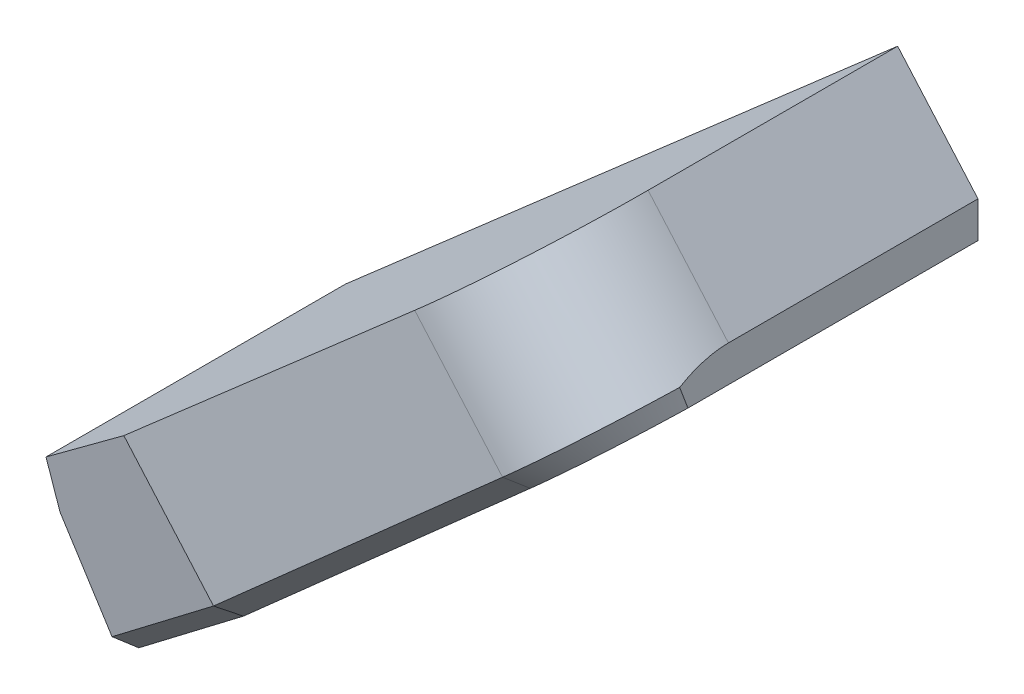
ISO-10303-21;
HEADER;
FILE_DESCRIPTION(('STEP AP214'),'2;1');
FILE_NAME('part.step','',(''),(''),'','','');
FILE_SCHEMA(('AUTOMOTIVE_DESIGN { 1 0 10303 214 1 1 1 1 }'));
ENDSEC;
DATA;
#1=APPLICATION_CONTEXT('core data for automotive mechanical design processes');
#2=APPLICATION_PROTOCOL_DEFINITION('international standard','automotive_design',2000,#1);
#3=PRODUCT_CONTEXT('',#1,'mechanical');
#4=PRODUCT('Part','Part','',(#3));
#5=PRODUCT_RELATED_PRODUCT_CATEGORY('part','',(#4));
#6=PRODUCT_DEFINITION_FORMATION('','',#4);
#7=PRODUCT_DEFINITION_CONTEXT('part definition',#1,'design');
#8=PRODUCT_DEFINITION('design','',#6,#7);
#9=PRODUCT_DEFINITION_SHAPE('','',#8);
#10=(LENGTH_UNIT() NAMED_UNIT(*) SI_UNIT(.MILLI.,.METRE.));
#11=(NAMED_UNIT(*) PLANE_ANGLE_UNIT() SI_UNIT($,.RADIAN.));
#12=(NAMED_UNIT(*) SI_UNIT($,.STERADIAN.) SOLID_ANGLE_UNIT());
#13=UNCERTAINTY_MEASURE_WITH_UNIT(LENGTH_MEASURE(1.E-05),#10,'distance_accuracy_value','');
#14=(GEOMETRIC_REPRESENTATION_CONTEXT(3) GLOBAL_UNCERTAINTY_ASSIGNED_CONTEXT((#13)) GLOBAL_UNIT_ASSIGNED_CONTEXT((#10,
#11,#12)) REPRESENTATION_CONTEXT('',''));
#15=CARTESIAN_POINT('',(0.,0.,0.));
#16=DIRECTION('',(0.,0.,1.));
#17=DIRECTION('',(1.,0.,0.));
#18=AXIS2_PLACEMENT_3D('',#15,#16,#17);
#19=CARTESIAN_POINT('',(713.784331276476,57.2270617719449,-19.05));
#20=DIRECTION('',(-1.,0.,0.));
#21=DIRECTION('',(0.,0.,1.));
#22=AXIS2_PLACEMENT_3D('',#19,#20,#21);
#23=PLANE('',#22);
#24=CARTESIAN_POINT('',(713.784331276476,33.7029371806042,4.7625));
#25=DIRECTION('',(-1.,0.,0.));
#26=DIRECTION('',(0.,1.,0.));
#27=AXIS2_PLACEMENT_3D('',#24,#25,#26);
#28=ELLIPSE('',#27,19.3103423347557,12.7);
#29=CARTESIAN_POINT('',(713.784331276476,53.0132795153599,4.7625));
#30=VERTEX_POINT('',#29);
#31=CARTESIAN_POINT('',(713.784331276476,51.6672722408811,9.42098174668878));
#32=VERTEX_POINT('',#31);
#33=EDGE_CURVE('E214',#30,#32,#28,.F.);
#34=ORIENTED_EDGE('',*,*,#33,.T.);
#35=CARTESIAN_POINT('',(713.784331276476,49.5606966341576,8.62972275566893));
#36=CARTESIAN_POINT('',(713.784331304837,49.6421115200021,8.66059883983428));
#37=CARTESIAN_POINT('',(713.784331597905,49.7235403944614,8.69143802243214));
#38=CARTESIAN_POINT('',(713.784332411528,49.8882108564469,8.75372407516755));
#39=CARTESIAN_POINT('',(713.784332936933,49.9714530162575,8.78516943237111));
#40=CARTESIAN_POINT('',(713.784333894609,50.1397497590857,8.848669443204));
#41=CARTESIAN_POINT('',(713.784334324638,50.2248048764804,8.88072268041721));
#42=CARTESIAN_POINT('',(713.784334925587,50.3967274476425,8.9454394332939));
#43=CARTESIAN_POINT('',(713.78433509087,50.4835954053474,8.97810161016965));
#44=CARTESIAN_POINT('',(713.784335099207,50.6591436368708,9.04403694860167));
#45=CARTESIAN_POINT('',(713.784334935555,50.7478243881636,9.0773088388525));
#46=CARTESIAN_POINT('',(713.784334344555,50.926998298572,9.14446392455359));
#47=CARTESIAN_POINT('',(713.784333911951,51.0174919132091,9.17834590460076));
#48=CARTESIAN_POINT('',(713.784332953845,51.2002917251027,9.24672118444291));
#49=CARTESIAN_POINT('',(713.784332426676,51.2925983594547,9.28121331562041));
#50=CARTESIAN_POINT('',(713.784331593389,51.4790245515618,9.35080839516426));
#51=CARTESIAN_POINT('',(713.78433129176,51.5731445327971,9.38591020916599));
#52=CARTESIAN_POINT('',(713.784331276476,51.6672751441984,9.42098348729397));
#53=B_SPLINE_CURVE_WITH_KNOTS('',3,(#35,#36,#37,#38,#39,#40,#41,#42,#43,#44,#45,#46,#47,#48,#49,
#50,#51,#52),.UNSPECIFIED.,.F.,.F.,(4,2,2,2,2,2,2,2,4),(0.,0.26121913580384,0.528169678245263,
0.80085270434248,1.07926916411968,1.36341989185319,1.6533056163849,1.94892697062322,
2.2502845003358),.UNSPECIFIED.);
#54=CARTESIAN_POINT('',(713.784331276476,49.5606966341576,8.62972275566891));
#55=VERTEX_POINT('',#54);
#56=EDGE_CURVE('E275',#32,#55,#53,.F.);
#57=ORIENTED_EDGE('',*,*,#56,.T.);
#58=DIRECTION('',(0.,0.,1.));
#59=VECTOR('',#58,1.);
#60=CARTESIAN_POINT('',(713.784331276476,49.5606966341576,-19.05));
#61=LINE('',#60,#59);
#62=CARTESIAN_POINT('',(713.784331276476,49.5606966341576,-19.05));
#63=VERTEX_POINT('',#62);
#64=EDGE_CURVE('E124',#63,#55,#61,.T.);
#65=ORIENTED_EDGE('',*,*,#64,.F.);
#66=DIRECTION('',(0.,-1.,0.));
#67=VECTOR('',#66,1.);
#68=CARTESIAN_POINT('',(713.784331276476,57.2270617719449,-19.05));
#69=LINE('',#68,#67);
#70=CARTESIAN_POINT('',(713.784331276476,53.01327951536,-19.05));
#71=VERTEX_POINT('',#70);
#72=EDGE_CURVE('E225',#71,#63,#69,.T.);
#73=ORIENTED_EDGE('',*,*,#72,.F.);
#74=DIRECTION('',(0.,0.,1.));
#75=VECTOR('',#74,1.);
#76=CARTESIAN_POINT('',(713.784331276476,53.0132795153599,-19.05));
#77=LINE('',#76,#75);
#78=EDGE_CURVE('E120',#71,#30,#77,.T.);
#79=ORIENTED_EDGE('',*,*,#78,.T.);
#80=EDGE_LOOP('',(#34,#57,#65,#73,#79));
#81=FACE_BOUND('',#80,.T.);
#82=ADVANCED_FACE('F33',(#81),#23,.F.);
#83=CARTESIAN_POINT('',(713.784331276476,49.5606966341576,-19.05));
#84=DIRECTION('',(-0.66308485715519,0.748544235307094,0.));
#85=DIRECTION('',(-0.748544235307094,-0.66308485715519,0.));
#86=AXIS2_PLACEMENT_3D('',#83,#84,#85);
#87=PLANE('',#86);
#88=ORIENTED_EDGE('',*,*,#64,.T.);
#89=CARTESIAN_POINT('',(705.480705262986,42.2050743351408,15.8544887273142));
#90=CARTESIAN_POINT('',(705.922192892045,42.5961584523409,15.8903938299688));
#91=CARTESIAN_POINT('',(706.365821397617,42.9891390276655,15.8791170099545));
#92=CARTESIAN_POINT('',(707.246121965533,43.7689379343943,15.762612512736));
#93=CARTESIAN_POINT('',(707.682779104303,44.15574304601,15.6573656048336));
#94=CARTESIAN_POINT('',(708.538051212872,44.9133709284914,15.3555472546245));
#95=CARTESIAN_POINT('',(708.956650739079,45.2841800189198,15.158981262232));
#96=CARTESIAN_POINT('',(709.765178063903,46.0003998498925,14.6795125676823));
#97=CARTESIAN_POINT('',(710.155091262996,46.345797657702,14.39661852326));
#98=CARTESIAN_POINT('',(710.89634438251,47.0024238070802,13.7516737358211));
#99=CARTESIAN_POINT('',(711.247670918172,47.3136402919932,13.3896346385306));
#100=CARTESIAN_POINT('',(711.902828578833,47.8940002805451,12.595589634467));
#101=CARTESIAN_POINT('',(712.206647873693,48.1631333046615,12.163598065713));
#102=CARTESIAN_POINT('',(712.759074882855,48.6524911370796,11.2406145441161));
#103=CARTESIAN_POINT('',(713.007672622019,48.8727071090788,10.7496392575266));
#104=CARTESIAN_POINT('',(713.443342234256,49.2586374375368,9.72115281201333));
#105=CARTESIAN_POINT('',(713.630421240179,49.4243581125056,9.1836676622926));
#106=CARTESIAN_POINT('',(713.784331276476,49.5606966341576,8.62972275566893));
#107=B_SPLINE_CURVE_WITH_KNOTS('',3,(#89,#90,#91,#92,#93,#94,#95,#96,#97,#98,#99,#100,#101,#102,
#103,#104,#105,#106),.UNSPECIFIED.,.F.,.F.,(4,2,2,2,2,2,2,2,4),(4.65162135877503,
4.81113636550038,4.97065137222574,5.13016637895109,5.28968138567645,5.4491963924018,
5.60871139912716,5.76822640585251,5.92774141257787),.UNSPECIFIED.);
#108=CARTESIAN_POINT('',(705.98588441586,42.6525784780102,15.875));
#109=VERTEX_POINT('',#108);
#110=EDGE_CURVE('E159',#55,#109,#107,.F.);
#111=ORIENTED_EDGE('',*,*,#110,.T.);
#112=DIRECTION('',(-0.748544235307094,-0.66308485715519,0.));
#113=VECTOR('',#112,1.);
#114=CARTESIAN_POINT('',(713.784331276476,49.5606966341576,15.875));
#115=LINE('',#114,#113);
#116=CARTESIAN_POINT('',(678.612948288187,18.4047403596793,15.875));
#117=VERTEX_POINT('',#116);
#118=EDGE_CURVE('E154',#109,#117,#115,.T.);
#119=ORIENTED_EDGE('',*,*,#118,.T.);
#120=DIRECTION('',(-0.697590960877624,-0.617948787564335,-0.362637763132305));
#121=VECTOR('',#120,1.);
#122=CARTESIAN_POINT('',(700.324002270979,37.6370989162351,27.1613389767259));
#123=LINE('',#122,#121);
#124=CARTESIAN_POINT('',(657.836177185816,0.,5.07434141893577));
#125=VERTEX_POINT('',#124);
#126=EDGE_CURVE('E123',#117,#125,#123,.T.);
#127=ORIENTED_EDGE('',*,*,#126,.T.);
#128=DIRECTION('',(0.,0.,1.));
#129=VECTOR('',#128,1.);
#130=CARTESIAN_POINT('',(657.836177185816,0.,-19.05));
#131=LINE('',#130,#129);
#132=CARTESIAN_POINT('',(657.836177185816,0.,-19.05));
#133=VERTEX_POINT('',#132);
#134=EDGE_CURVE('E147',#133,#125,#131,.T.);
#135=ORIENTED_EDGE('',*,*,#134,.F.);
#136=DIRECTION('',(-0.748544235307094,-0.66308485715519,0.));
#137=VECTOR('',#136,1.);
#138=CARTESIAN_POINT('',(713.784331276476,49.5606966341576,-19.05));
#139=LINE('',#138,#137);
#140=EDGE_CURVE('E227',#63,#133,#139,.T.);
#141=ORIENTED_EDGE('',*,*,#140,.F.);
#142=EDGE_LOOP('',(#88,#111,#119,#127,#135,#141));
#143=FACE_BOUND('',#142,.T.);
#144=ADVANCED_FACE('F165',(#143),#87,.F.);
#145=CARTESIAN_POINT('',(657.836177185816,0.,-19.05));
#146=DIRECTION('',(0.923162342718971,0.384410313318493,0.));
#147=DIRECTION('',(-0.384410313318493,0.923162342718971,0.));
#148=AXIS2_PLACEMENT_3D('',#145,#146,#147);
#149=PLANE('',#148);
#150=ORIENTED_EDGE('',*,*,#134,.T.);
#151=DIRECTION('',(0.254003340701628,-0.609989667124988,-0.750596368838246));
#152=VECTOR('',#151,1.);
#153=CARTESIAN_POINT('',(650.534949686741,17.5339163629187,26.6499428804333));
#154=LINE('',#153,#152);
#155=CARTESIAN_POINT('',(657.191041884151,1.54929406371575,6.98075813574454));
#156=VERTEX_POINT('',#155);
#157=EDGE_CURVE('E44',#125,#156,#154,.F.);
#158=ORIENTED_EDGE('',*,*,#157,.T.);
#159=DIRECTION('',(-0.381508284268291,0.916193112592195,0.122644239462319));
#160=VECTOR('',#159,1.);
#161=CARTESIAN_POINT('',(659.044447107056,-2.90166328135086,6.38494021159486));
#162=LINE('',#161,#160);
#163=CARTESIAN_POINT('',(653.432095085385,10.5764143377497,8.1891543628362));
#164=VERTEX_POINT('',#163);
#165=EDGE_CURVE('E223',#156,#164,#162,.T.);
#166=ORIENTED_EDGE('',*,*,#165,.T.);
#167=DIRECTION('',(0.,0.,1.));
#168=VECTOR('',#167,1.);
#169=CARTESIAN_POINT('',(653.432095085385,10.5764143377497,-19.05));
#170=LINE('',#169,#168);
#171=CARTESIAN_POINT('',(653.432095085385,10.5764143377497,-19.05));
#172=VERTEX_POINT('',#171);
#173=EDGE_CURVE('E141',#172,#164,#170,.T.);
#174=ORIENTED_EDGE('',*,*,#173,.F.);
#175=DIRECTION('',(-0.384410313318493,0.923162342718971,0.));
#176=VECTOR('',#175,1.);
#177=CARTESIAN_POINT('',(657.836177185816,0.,-19.05));
#178=LINE('',#177,#176);
#179=EDGE_CURVE('E229',#133,#172,#178,.T.);
#180=ORIENTED_EDGE('',*,*,#179,.F.);
#181=EDGE_LOOP('',(#150,#158,#166,#174,#180));
#182=FACE_BOUND('',#181,.T.);
#183=ADVANCED_FACE('F175',(#182),#149,.F.);
#184=CARTESIAN_POINT('',(653.432095085385,10.5764143377497,-19.05));
#185=DIRECTION('',(1.,0.,0.));
#186=DIRECTION('',(0.,0.,-1.));
#187=AXIS2_PLACEMENT_3D('',#184,#185,#186);
#188=PLANE('',#187);
#189=ORIENTED_EDGE('',*,*,#173,.T.);
#190=DIRECTION('',(0.,0.96877660271704,0.24793526176813));
#191=VECTOR('',#190,1.);
#192=CARTESIAN_POINT('',(653.432095085385,4.03373614736392,6.51471195243075));
#193=LINE('',#192,#191);
#194=CARTESIAN_POINT('',(653.432095085385,15.7960671975197,9.52499999999993));
#195=VERTEX_POINT('',#194);
#196=EDGE_CURVE('E218',#164,#195,#193,.T.);
#197=ORIENTED_EDGE('',*,*,#196,.T.);
#198=DIRECTION('',(0.,0.,1.));
#199=VECTOR('',#198,1.);
#200=CARTESIAN_POINT('',(653.432095085385,15.7960671975198,-19.05));
#201=LINE('',#200,#199);
#202=CARTESIAN_POINT('',(653.432095085385,15.7960671975198,-19.05));
#203=VERTEX_POINT('',#202);
#204=EDGE_CURVE('E139',#203,#195,#201,.T.);
#205=ORIENTED_EDGE('',*,*,#204,.F.);
#206=DIRECTION('',(0.,1.,0.));
#207=VECTOR('',#206,1.);
#208=CARTESIAN_POINT('',(653.432095085385,10.5764143377497,-19.05));
#209=LINE('',#208,#207);
#210=EDGE_CURVE('E130',#172,#203,#209,.T.);
#211=ORIENTED_EDGE('',*,*,#210,.F.);
#212=EDGE_LOOP('',(#189,#197,#205,#211));
#213=FACE_BOUND('',#212,.T.);
#214=ADVANCED_FACE('F236',(#213),#188,.F.);
#215=CARTESIAN_POINT('',(653.432095085385,15.7960671975198,-19.05));
#216=DIRECTION('',(0.657678656330287,-0.753298602818025,0.));
#217=DIRECTION('',(0.753298602818025,0.657678656330287,0.));
#218=AXIS2_PLACEMENT_3D('',#215,#216,#217);
#219=PLANE('',#218);
#220=ORIENTED_EDGE('',*,*,#204,.T.);
#221=DIRECTION('',(-0.702019306823435,-0.612908496978974,-0.362645925357115));
#222=VECTOR('',#221,1.);
#223=CARTESIAN_POINT('',(646.777147884434,9.98586561650411,6.08721778741128));
#224=LINE('',#223,#222);
#225=CARTESIAN_POINT('',(668.797711677998,29.2112494858078,17.4625));
#226=VERTEX_POINT('',#225);
#227=EDGE_CURVE('E205',#226,#195,#224,.T.);
#228=ORIENTED_EDGE('',*,*,#227,.F.);
#229=DIRECTION('',(-0.753298602818027,-0.657678656330285,0.));
#230=VECTOR('',#229,1.);
#231=CARTESIAN_POINT('',(668.797711677998,29.2112494858078,17.4625));
#232=LINE('',#231,#230);
#233=CARTESIAN_POINT('',(696.5510738829,53.441739088849,17.4625));
#234=VERTEX_POINT('',#233);
#235=EDGE_CURVE('E239',#234,#226,#232,.T.);
#236=ORIENTED_EDGE('',*,*,#235,.F.);
#237=CARTESIAN_POINT('',(696.5510738829,53.441739088849,4.7625));
#238=DIRECTION('',(0.657678656330287,-0.753298602818025,0.));
#239=DIRECTION('',(-0.753298602818025,-0.657678656330287,0.));
#240=AXIS2_PLACEMENT_3D('',#237,#238,#239);
#241=CIRCLE('',#240,12.7);
#242=CARTESIAN_POINT('',(706.117966138689,61.7942580242437,4.7625));
#243=VERTEX_POINT('',#242);
#244=EDGE_CURVE('E138',#243,#234,#241,.T.);
#245=ORIENTED_EDGE('',*,*,#244,.F.);
#246=DIRECTION('',(0.,0.,1.));
#247=VECTOR('',#246,1.);
#248=CARTESIAN_POINT('',(706.117966138689,61.7942580242437,-19.05));
#249=LINE('',#248,#247);
#250=CARTESIAN_POINT('',(706.117966138689,61.7942580242437,-19.05));
#251=VERTEX_POINT('',#250);
#252=EDGE_CURVE('E117',#251,#243,#249,.T.);
#253=ORIENTED_EDGE('',*,*,#252,.F.);
#254=DIRECTION('',(0.753298602818025,0.657678656330287,0.));
#255=VECTOR('',#254,1.);
#256=CARTESIAN_POINT('',(653.432095085385,15.7960671975198,-19.05));
#257=LINE('',#256,#255);
#258=EDGE_CURVE('E127',#203,#251,#257,.T.);
#259=ORIENTED_EDGE('',*,*,#258,.F.);
#260=EDGE_LOOP('',(#220,#228,#236,#245,#253,#259));
#261=FACE_BOUND('',#260,.T.);
#262=ADVANCED_FACE('F135',(#261),#219,.F.);
#263=CARTESIAN_POINT('',(0.,0.,-19.05));
#264=DIRECTION('',(0.,0.,1.));
#265=DIRECTION('',(1.,0.,0.));
#266=AXIS2_PLACEMENT_3D('',#263,#264,#265);
#267=PLANE('',#266);
#268=ORIENTED_EDGE('',*,*,#258,.T.);
#269=DIRECTION('',(0.657678656330287,-0.753298602818025,0.));
#270=VECTOR('',#269,1.);
#271=CARTESIAN_POINT('',(431.307474317415,376.55946674152,-19.05));
#272=LINE('',#271,#270);
#273=EDGE_CURVE('E112',#251,#71,#272,.T.);
#274=ORIENTED_EDGE('',*,*,#273,.T.);
#275=ORIENTED_EDGE('',*,*,#72,.T.);
#276=ORIENTED_EDGE('',*,*,#140,.T.);
#277=ORIENTED_EDGE('',*,*,#179,.T.);
#278=ORIENTED_EDGE('',*,*,#210,.T.);
#279=EDGE_LOOP('',(#268,#274,#275,#276,#277,#278));
#280=FACE_BOUND('',#279,.T.);
#281=ADVANCED_FACE('F128',(#280),#267,.F.);
#282=CARTESIAN_POINT('',(659.305926287526,-4.36447276717927,6.08721778741128));
#283=DIRECTION('',(0.273180668889165,0.238504484912521,-0.93192699972792));
#284=DIRECTION('',(-0.95962030219126,0.,-0.281298552471134));
#285=AXIS2_PLACEMENT_3D('',#282,#283,#284);
#286=PLANE('',#285);
#287=ORIENTED_EDGE('',*,*,#165,.F.);
#288=DIRECTION('',(0.697590960877624,0.617948787564335,0.362637763132305));
#289=VECTOR('',#288,1.);
#290=CARTESIAN_POINT('',(655.444893388317,0.00249886936541741,6.07303510012875));
#291=LINE('',#290,#289);
#292=CARTESIAN_POINT('',(677.354326357339,19.410587991386,17.4625));
#293=VERTEX_POINT('',#292);
#294=EDGE_CURVE('E11',#156,#293,#291,.T.);
#295=ORIENTED_EDGE('',*,*,#294,.T.);
#296=DIRECTION('',(-0.657678656330287,0.753298602818025,0.));
#297=VECTOR('',#296,1.);
#298=CARTESIAN_POINT('',(681.32649008109,14.8609111021245,17.4625));
#299=LINE('',#298,#297);
#300=EDGE_CURVE('E191',#293,#226,#299,.T.);
#301=ORIENTED_EDGE('',*,*,#300,.T.);
#302=ORIENTED_EDGE('',*,*,#227,.T.);
#303=ORIENTED_EDGE('',*,*,#196,.F.);
#304=EDGE_LOOP('',(#287,#295,#301,#302,#303));
#305=FACE_BOUND('',#304,.T.);
#306=ADVANCED_FACE('F331',(#305),#286,.F.);
#307=CARTESIAN_POINT('',(681.32649008109,14.8609111021245,17.4625));
#308=DIRECTION('',(0.,0.,-1.));
#309=DIRECTION('',(-1.,0.,0.));
#310=AXIS2_PLACEMENT_3D('',#307,#308,#309);
#311=PLANE('',#310);
#312=ORIENTED_EDGE('',*,*,#300,.F.);
#313=DIRECTION('',(0.748544235307094,0.66308485715519,0.));
#314=VECTOR('',#313,1.);
#315=CARTESIAN_POINT('',(677.321774873882,19.3817600553997,17.4625));
#316=LINE('',#315,#314);
#317=CARTESIAN_POINT('',(704.933237202746,43.8408924494508,17.4625));
#318=VERTEX_POINT('',#317);
#319=EDGE_CURVE('E200',#293,#318,#316,.T.);
#320=ORIENTED_EDGE('',*,*,#319,.T.);
#321=DIRECTION('',(-0.657678656330287,0.753298602818025,0.));
#322=VECTOR('',#321,1.);
#323=CARTESIAN_POINT('',(709.079852285992,39.0914007051657,17.4625));
#324=LINE('',#323,#322);
#325=EDGE_CURVE('E199',#318,#234,#324,.T.);
#326=ORIENTED_EDGE('',*,*,#325,.T.);
#327=ORIENTED_EDGE('',*,*,#235,.T.);
#328=EDGE_LOOP('',(#312,#320,#326,#327));
#329=FACE_BOUND('',#328,.T.);
#330=ADVANCED_FACE('F324',(#329),#311,.F.);
#331=CARTESIAN_POINT('',(709.079852285992,39.0914007051657,4.7625));
#332=DIRECTION('',(-0.657678656330287,0.753298602818025,0.));
#333=DIRECTION('',(-0.753298602818025,-0.657678656330287,0.));
#334=AXIS2_PLACEMENT_3D('',#331,#332,#333);
#335=CYLINDRICAL_SURFACE('',#334,12.7);
#336=ORIENTED_EDGE('',*,*,#325,.F.);
#337=CARTESIAN_POINT('',(713.852794808201,51.7278131754267,9.18218314933589));
#338=CARTESIAN_POINT('',(713.676758546246,51.572157020229,9.8152630426201));
#339=CARTESIAN_POINT('',(713.462784917983,51.3829555913895,10.429531785158));
#340=CARTESIAN_POINT('',(712.964483105895,50.9423432804,11.6049448657446));
#341=CARTESIAN_POINT('',(712.680146763799,50.6909251844783,12.1660594789898));
#342=CARTESIAN_POINT('',(712.048302421253,50.1322308566598,13.2208977893862));
#343=CARTESIAN_POINT('',(711.700805829975,49.8249647130704,13.7146024393909));
#344=CARTESIAN_POINT('',(710.951462198149,49.1623742481452,14.6220824440348));
#345=CARTESIAN_POINT('',(710.54962868845,48.8070618911624,15.035841412367));
#346=CARTESIAN_POINT('',(709.701812448129,48.0573992090673,15.77292116944));
#347=CARTESIAN_POINT('',(709.255845026469,47.6630624205653,16.0962286487797));
#348=CARTESIAN_POINT('',(708.331083189138,46.8453623031314,16.6441928711223));
#349=CARTESIAN_POINT('',(707.85230547183,46.4220137393573,16.8688397195708));
#350=CARTESIAN_POINT('',(706.87407878455,45.55703851571,17.2137749769527));
#351=CARTESIAN_POINT('',(706.374647478353,45.1154274746381,17.3340571574126));
#352=CARTESIAN_POINT('',(705.367794221084,44.2251398422209,17.4672051542337));
#353=CARTESIAN_POINT('',(704.860389339011,43.7764783437593,17.4800929485357));
#354=CARTESIAN_POINT('',(704.355433107512,43.329982010187,17.4390585455019));
#355=B_SPLINE_CURVE_WITH_KNOTS('',3,(#337,#338,#339,#340,#341,#342,#343,#344,#345,#346,#347,
#348,#349,#350,#351,#352,#353,#354),.UNSPECIFIED.,.F.,.F.,(4,2,2,2,2,2,2,2,4),(4.65162135877503,
4.81113636550038,4.97065137222574,5.13016637895109,5.28968138567645,5.4491963924018,
5.60871139912716,5.76822640585251,5.92774141257787),.UNSPECIFIED.);
#356=EDGE_CURVE('E264',#318,#32,#355,.F.);
#357=ORIENTED_EDGE('',*,*,#356,.T.);
#358=ORIENTED_EDGE('',*,*,#33,.F.);
#359=DIRECTION('',(-0.657678656330287,0.753298602818025,0.));
#360=VECTOR('',#359,1.);
#361=CARTESIAN_POINT('',(718.646744541781,47.4439196405603,4.7625));
#362=LINE('',#361,#360);
#363=EDGE_CURVE('E209',#30,#243,#362,.T.);
#364=ORIENTED_EDGE('',*,*,#363,.T.);
#365=ORIENTED_EDGE('',*,*,#244,.T.);
#366=EDGE_LOOP('',(#336,#357,#358,#364,#365));
#367=FACE_BOUND('',#366,.T.);
#368=ADVANCED_FACE('F318',(#367),#335,.T.);
#369=CARTESIAN_POINT('',(718.646744541781,47.4439196405603,4.7625));
#370=DIRECTION('',(-0.753298602818025,-0.657678656330287,0.));
#371=DIRECTION('',(0.657678656330287,-0.753298602818025,0.));
#372=AXIS2_PLACEMENT_3D('',#369,#370,#371);
#373=PLANE('',#372);
#374=ORIENTED_EDGE('',*,*,#273,.F.);
#375=ORIENTED_EDGE('',*,*,#252,.T.);
#376=ORIENTED_EDGE('',*,*,#363,.F.);
#377=ORIENTED_EDGE('',*,*,#78,.F.);
#378=EDGE_LOOP('',(#374,#375,#376,#377));
#379=FACE_BOUND('',#378,.T.);
#380=ADVANCED_FACE('F114',(#379),#373,.F.);
#381=CARTESIAN_POINT('',(700.324002270979,37.6370989162351,27.1613389767259));
#382=DIRECTION('',(-0.275201167597199,0.698390956709627,-0.660692355744601));
#383=DIRECTION('',(-0.697590960877624,-0.617948787564335,-0.362637763132305));
#384=AXIS2_PLACEMENT_3D('',#381,#382,#383);
#385=PLANE('',#384);
#386=ORIENTED_EDGE('',*,*,#157,.F.);
#387=ORIENTED_EDGE('',*,*,#126,.F.);
#388=CARTESIAN_POINT('',(678.612948288187,18.4047403596793,15.875));
#389=CARTESIAN_POINT('',(677.354325104551,19.4105886933377,17.4625012638338));
#390=B_SPLINE_CURVE_WITH_KNOTS('',1,(#388,#389),.UNSPECIFIED.,.F.,.F.,(2,2),(0.,1.),.UNSPECIFIED.);
#391=EDGE_CURVE('E241',#293,#117,#390,.F.);
#392=ORIENTED_EDGE('',*,*,#391,.F.);
#393=ORIENTED_EDGE('',*,*,#294,.F.);
#394=EDGE_LOOP('',(#386,#387,#392,#393));
#395=FACE_BOUND('',#394,.T.);
#396=ADVANCED_FACE('F309',(#395),#385,.F.);
#397=CARTESIAN_POINT('',(713.784331276476,49.5606966341576,15.875));
#398=DIRECTION('',(-0.468871798996551,0.529300704803749,-0.707106781186542));
#399=DIRECTION('',(-0.748544235307094,-0.66308485715519,0.));
#400=AXIS2_PLACEMENT_3D('',#397,#398,#399);
#401=PLANE('',#400);
#402=ORIENTED_EDGE('',*,*,#391,.T.);
#403=ORIENTED_EDGE('',*,*,#118,.F.);
#404=CARTESIAN_POINT('',(704.933237204039,43.8408924505952,17.4624917223131));
#405=CARTESIAN_POINT('',(705.98588441461,42.6525784769033,15.874992757024));
#406=B_SPLINE_CURVE_WITH_KNOTS('',1,(#404,#405),.UNSPECIFIED.,.F.,.F.,(2,2),(0.,1.),.UNSPECIFIED.);
#407=EDGE_CURVE('E246',#318,#109,#406,.T.);
#408=ORIENTED_EDGE('',*,*,#407,.F.);
#409=ORIENTED_EDGE('',*,*,#319,.F.);
#410=EDGE_LOOP('',(#402,#403,#408,#409));
#411=FACE_BOUND('',#410,.T.);
#412=ADVANCED_FACE('F35',(#411),#401,.F.);
#413=CARTESIAN_POINT('',(704.355433107512,43.329982010187,17.4390585455019));
#414=CARTESIAN_POINT('',(704.860389339011,43.7764783437593,17.4800929485357));
#415=CARTESIAN_POINT('',(705.367794221084,44.2251398422209,17.4672051542337));
#416=CARTESIAN_POINT('',(706.374647478353,45.1154274746381,17.3340571574126));
#417=CARTESIAN_POINT('',(706.87407878455,45.55703851571,17.2137749769527));
#418=CARTESIAN_POINT('',(707.85230547183,46.4220137393573,16.8688397195708));
#419=CARTESIAN_POINT('',(708.331083189138,46.8453623031314,16.6441928711223));
#420=CARTESIAN_POINT('',(709.255845026469,47.6630624205653,16.0962286487797));
#421=CARTESIAN_POINT('',(709.701812448129,48.0573992090673,15.77292116944));
#422=CARTESIAN_POINT('',(710.54962868845,48.8070618911624,15.035841412367));
#423=CARTESIAN_POINT('',(710.951462198149,49.1623742481452,14.6220824440348));
#424=CARTESIAN_POINT('',(711.700805829975,49.8249647130704,13.7146024393909));
#425=CARTESIAN_POINT('',(712.048302421253,50.1322308566598,13.2208977893862));
#426=CARTESIAN_POINT('',(712.680146763799,50.6909251844783,12.1660594789898));
#427=CARTESIAN_POINT('',(712.964483105895,50.9423432804,11.6049448657446));
#428=CARTESIAN_POINT('',(713.462784917983,51.3829555913895,10.429531785158));
#429=CARTESIAN_POINT('',(713.676758546246,51.572157020229,9.8152630426201));
#430=CARTESIAN_POINT('',(713.852794808201,51.7278131754267,9.18218314933589));
#431=CARTESIAN_POINT('',(705.480705262986,42.2050743351408,15.8544887273142));
#432=CARTESIAN_POINT('',(705.922192892045,42.5961584523409,15.8903938299688));
#433=CARTESIAN_POINT('',(706.365821397617,42.9891390276655,15.8791170099545));
#434=CARTESIAN_POINT('',(707.246121965533,43.7689379343943,15.762612512736));
#435=CARTESIAN_POINT('',(707.682779104303,44.15574304601,15.6573656048336));
#436=CARTESIAN_POINT('',(708.538051212872,44.9133709284914,15.3555472546245));
#437=CARTESIAN_POINT('',(708.956650739079,45.2841800189198,15.158981262232));
#438=CARTESIAN_POINT('',(709.765178063903,46.0003998498925,14.6795125676823));
#439=CARTESIAN_POINT('',(710.155091262996,46.345797657702,14.39661852326));
#440=CARTESIAN_POINT('',(710.89634438251,47.0024238070802,13.7516737358211));
#441=CARTESIAN_POINT('',(711.247670918172,47.3136402919932,13.3896346385306));
#442=CARTESIAN_POINT('',(711.902828578833,47.8940002805451,12.595589634467));
#443=CARTESIAN_POINT('',(712.206647873693,48.1631333046615,12.163598065713));
#444=CARTESIAN_POINT('',(712.759074882855,48.6524911370796,11.2406145441161));
#445=CARTESIAN_POINT('',(713.007672622019,48.8727071090788,10.7496392575266));
#446=CARTESIAN_POINT('',(713.443342234256,49.2586374375368,9.72115281201333));
#447=CARTESIAN_POINT('',(713.630421240179,49.4243581125056,9.1836676622926));
#448=CARTESIAN_POINT('',(713.784331276476,49.5606966341576,8.62972275566893));
#449=B_SPLINE_SURFACE_WITH_KNOTS('',1,3,((#413,#414,#415,#416,#417,#418,#419,#420,#421,#422,
#423,#424,#425,#426,#427,#428,#429,#430),(#431,#432,#433,#434,#435,#436,#437,#438,#439,#440,
#441,#442,#443,#444,#445,#446,#447,#448)),.UNSPECIFIED.,.F.,.F.,.F.,(2,2),(4,2,2,2,2,2,2,2,4),
(0.,1.),(4.65162135877503,4.81113636550038,4.97065137222574,5.13016637895109,5.28968138567645,
5.4491963924018,5.60871139912716,5.76822640585251,5.92774141257787),.UNSPECIFIED.);
#450=ORIENTED_EDGE('',*,*,#56,.F.);
#451=ORIENTED_EDGE('',*,*,#356,.F.);
#452=ORIENTED_EDGE('',*,*,#407,.T.);
#453=ORIENTED_EDGE('',*,*,#110,.F.);
#454=EDGE_LOOP('',(#450,#451,#452,#453));
#455=FACE_BOUND('',#454,.T.);
#456=ADVANCED_FACE('F181',(#455),#449,.T.);
#457=CLOSED_SHELL('',(#82,#144,#183,#214,#262,#281,#306,#330,#368,#380,#396,#412,#456));
#458=MANIFOLD_SOLID_BREP('B2',#457);
#459=ADVANCED_BREP_SHAPE_REPRESENTATION('',(#18,#458),#14);
#460=SHAPE_DEFINITION_REPRESENTATION(#9,#459);
ENDSEC;
END-ISO-10303-21;
